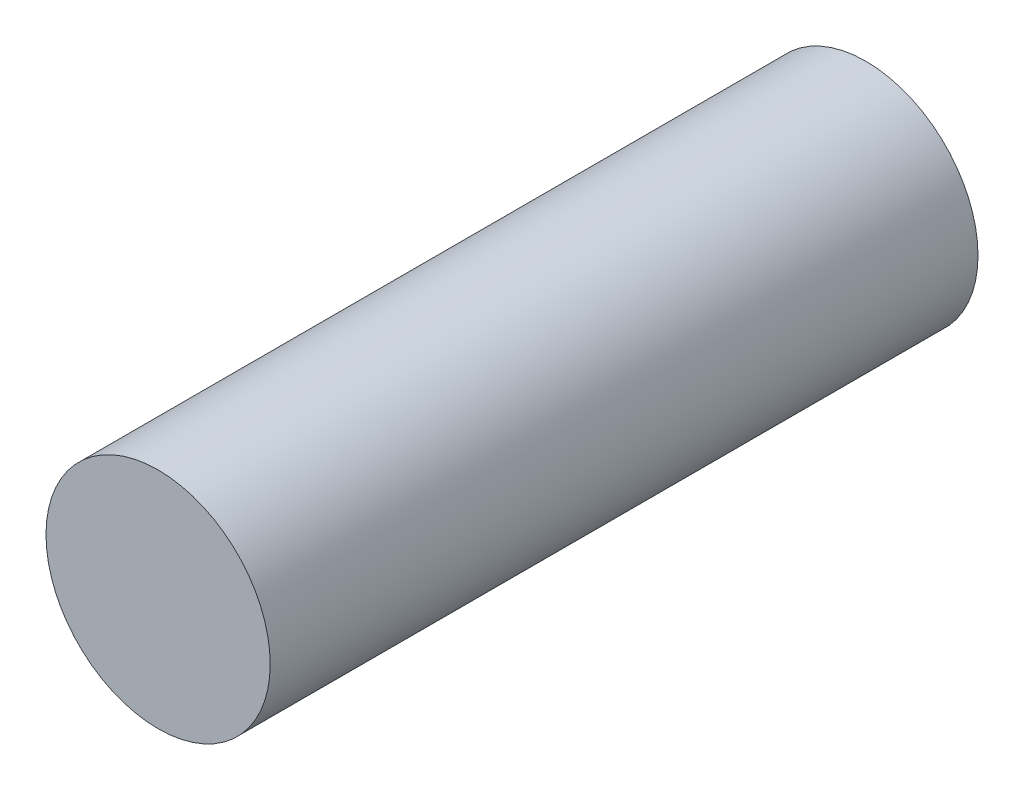
ISO-10303-21;
HEADER;
FILE_DESCRIPTION(('STEP AP214'),'2;1');
FILE_NAME('part.step','',(''),(''),'','','');
FILE_SCHEMA(('AUTOMOTIVE_DESIGN { 1 0 10303 214 1 1 1 1 }'));
ENDSEC;
DATA;
#1=APPLICATION_CONTEXT('core data for automotive mechanical design processes');
#2=APPLICATION_PROTOCOL_DEFINITION('international standard','automotive_design',2000,#1);
#3=PRODUCT_CONTEXT('',#1,'mechanical');
#4=PRODUCT('Part','Part','',(#3));
#5=PRODUCT_RELATED_PRODUCT_CATEGORY('part','',(#4));
#6=PRODUCT_DEFINITION_FORMATION('','',#4);
#7=PRODUCT_DEFINITION_CONTEXT('part definition',#1,'design');
#8=PRODUCT_DEFINITION('design','',#6,#7);
#9=PRODUCT_DEFINITION_SHAPE('','',#8);
#10=(LENGTH_UNIT() NAMED_UNIT(*) SI_UNIT(.MILLI.,.METRE.));
#11=(NAMED_UNIT(*) PLANE_ANGLE_UNIT() SI_UNIT($,.RADIAN.));
#12=(NAMED_UNIT(*) SI_UNIT($,.STERADIAN.) SOLID_ANGLE_UNIT());
#13=UNCERTAINTY_MEASURE_WITH_UNIT(LENGTH_MEASURE(1.E-05),#10,'distance_accuracy_value','');
#14=(GEOMETRIC_REPRESENTATION_CONTEXT(3) GLOBAL_UNCERTAINTY_ASSIGNED_CONTEXT((#13)) GLOBAL_UNIT_ASSIGNED_CONTEXT((#10,
#11,#12)) REPRESENTATION_CONTEXT('',''));
#15=CARTESIAN_POINT('',(0.,0.,0.));
#16=DIRECTION('',(0.,0.,1.));
#17=DIRECTION('',(1.,0.,0.));
#18=AXIS2_PLACEMENT_3D('',#15,#16,#17);
#19=CARTESIAN_POINT('',(81.4431104831983,-68.4681130519978,81.2787171389936));
#20=DIRECTION('',(0.,0.,-1.));
#21=DIRECTION('',(-1.,0.,0.));
#22=AXIS2_PLACEMENT_3D('',#19,#20,#21);
#23=CYLINDRICAL_SURFACE('',#22,8.88999999999999);
#24=CARTESIAN_POINT('',(81.4431104831983,-68.4681130519978,0.));
#25=DIRECTION('',(0.,0.,1.));
#26=DIRECTION('',(1.,0.,0.));
#27=AXIS2_PLACEMENT_3D('',#24,#25,#26);
#28=CIRCLE('',#27,8.88999999999999);
#29=CARTESIAN_POINT('',(90.3331104831983,-68.4681130519978,0.));
#30=VERTEX_POINT('',#29);
#31=EDGE_CURVE('E35',#30,#30,#28,.T.);
#32=ORIENTED_EDGE('',*,*,#31,.T.);
#33=EDGE_LOOP('',(#32));
#34=FACE_BOUND('',#33,.T.);
#35=CARTESIAN_POINT('',(81.4431104831983,-68.4681130519978,56.134));
#36=DIRECTION('',(0.,0.,1.));
#37=DIRECTION('',(1.,0.,0.));
#38=AXIS2_PLACEMENT_3D('',#35,#36,#37);
#39=CIRCLE('',#38,8.88999999999999);
#40=CARTESIAN_POINT('',(90.3331104831983,-68.4681130519978,56.134));
#41=VERTEX_POINT('',#40);
#42=EDGE_CURVE('E10',#41,#41,#39,.T.);
#43=ORIENTED_EDGE('',*,*,#42,.F.);
#44=EDGE_LOOP('',(#43));
#45=FACE_BOUND('',#44,.T.);
#46=ADVANCED_FACE('F28',(#34,#45),#23,.T.);
#47=CARTESIAN_POINT('',(81.4431104831983,-68.4681130519978,0.));
#48=DIRECTION('',(0.,0.,1.));
#49=DIRECTION('',(1.,0.,0.));
#50=AXIS2_PLACEMENT_3D('',#47,#48,#49);
#51=PLANE('',#50);
#52=ORIENTED_EDGE('',*,*,#31,.F.);
#53=EDGE_LOOP('',(#52));
#54=FACE_BOUND('',#53,.T.);
#55=ADVANCED_FACE('F43',(#54),#51,.F.);
#56=CARTESIAN_POINT('',(0.,0.,56.134));
#57=DIRECTION('',(0.,0.,1.));
#58=DIRECTION('',(1.,0.,0.));
#59=AXIS2_PLACEMENT_3D('',#56,#57,#58);
#60=PLANE('',#59);
#61=ORIENTED_EDGE('',*,*,#42,.T.);
#62=EDGE_LOOP('',(#61));
#63=FACE_BOUND('',#62,.T.);
#64=ADVANCED_FACE('F30',(#63),#60,.T.);
#65=CLOSED_SHELL('',(#46,#55,#64));
#66=MANIFOLD_SOLID_BREP('B2',#65);
#67=ADVANCED_BREP_SHAPE_REPRESENTATION('',(#18,#66),#14);
#68=SHAPE_DEFINITION_REPRESENTATION(#9,#67);
ENDSEC;
END-ISO-10303-21;
